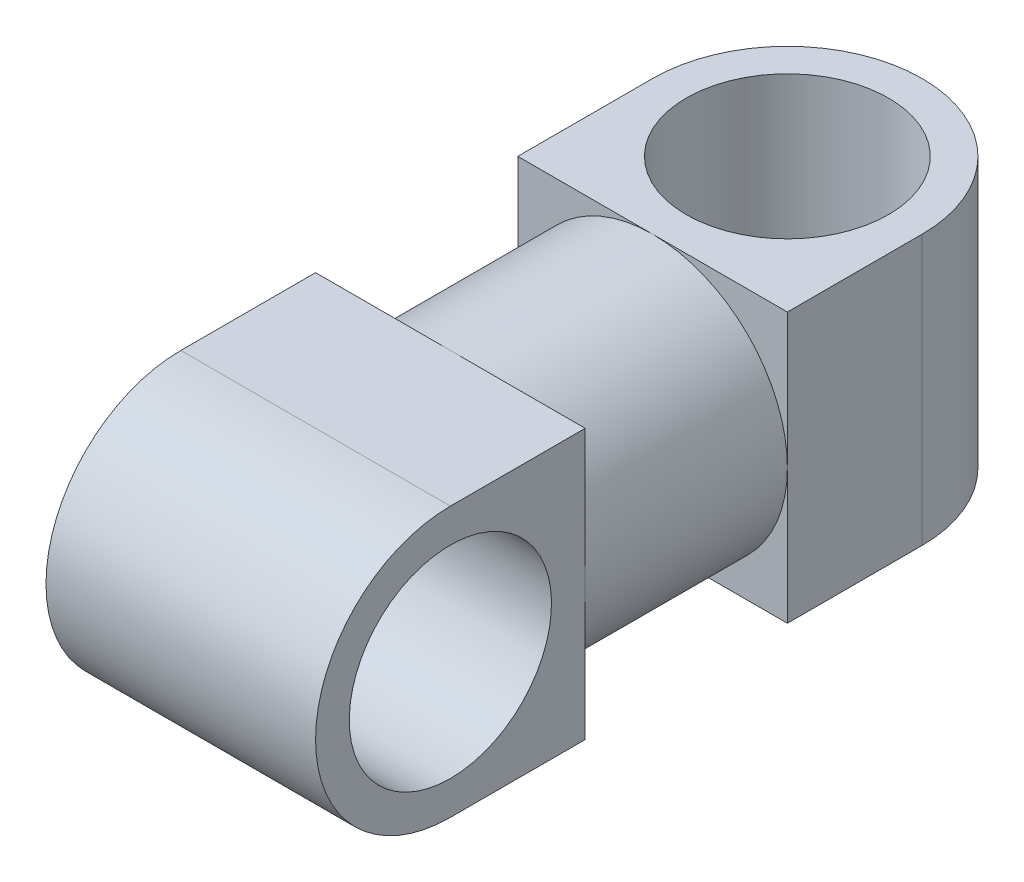
ISO-10303-21;
HEADER;
FILE_DESCRIPTION(('STEP AP214'),'2;1');
FILE_NAME('part.step','',(''),(''),'','','');
FILE_SCHEMA(('AUTOMOTIVE_DESIGN { 1 0 10303 214 1 1 1 1 }'));
ENDSEC;
DATA;
#1=APPLICATION_CONTEXT('core data for automotive mechanical design processes');
#2=APPLICATION_PROTOCOL_DEFINITION('international standard','automotive_design',2000,#1);
#3=PRODUCT_CONTEXT('',#1,'mechanical');
#4=PRODUCT('Part','Part','',(#3));
#5=PRODUCT_RELATED_PRODUCT_CATEGORY('part','',(#4));
#6=PRODUCT_DEFINITION_FORMATION('','',#4);
#7=PRODUCT_DEFINITION_CONTEXT('part definition',#1,'design');
#8=PRODUCT_DEFINITION('design','',#6,#7);
#9=PRODUCT_DEFINITION_SHAPE('','',#8);
#10=(LENGTH_UNIT() NAMED_UNIT(*) SI_UNIT(.MILLI.,.METRE.));
#11=(NAMED_UNIT(*) PLANE_ANGLE_UNIT() SI_UNIT($,.RADIAN.));
#12=(NAMED_UNIT(*) SI_UNIT($,.STERADIAN.) SOLID_ANGLE_UNIT());
#13=UNCERTAINTY_MEASURE_WITH_UNIT(LENGTH_MEASURE(1.E-05),#10,'distance_accuracy_value','');
#14=(GEOMETRIC_REPRESENTATION_CONTEXT(3) GLOBAL_UNCERTAINTY_ASSIGNED_CONTEXT((#13)) GLOBAL_UNIT_ASSIGNED_CONTEXT((#10,
#11,#12)) REPRESENTATION_CONTEXT('',''));
#15=CARTESIAN_POINT('',(0.,0.,0.));
#16=DIRECTION('',(0.,0.,1.));
#17=DIRECTION('',(1.,0.,0.));
#18=AXIS2_PLACEMENT_3D('',#15,#16,#17);
#19=CARTESIAN_POINT('',(0.,20.,50.));
#20=DIRECTION('',(0.,0.,1.));
#21=DIRECTION('',(1.,0.,0.));
#22=AXIS2_PLACEMENT_3D('',#19,#20,#21);
#23=PLANE('',#22);
#24=CARTESIAN_POINT('',(0.,20.,50.));
#25=DIRECTION('',(0.,0.,1.));
#26=DIRECTION('',(1.,0.,0.));
#27=AXIS2_PLACEMENT_3D('',#24,#25,#26);
#28=CIRCLE('',#27,20.);
#29=CARTESIAN_POINT('',(-1.49460359049434,0.0559241851801654,50.));
#30=VERTEX_POINT('',#29);
#31=CARTESIAN_POINT('',(1.49460359049433,0.0559241851801627,50.));
#32=VERTEX_POINT('',#31);
#33=EDGE_CURVE('E445',#30,#32,#28,.T.);
#34=ORIENTED_EDGE('',*,*,#33,.T.);
#35=DIRECTION('',(-1.,0.,0.));
#36=VECTOR('',#35,1.);
#37=CARTESIAN_POINT('',(20.,0.0559241851801606,50.));
#38=LINE('',#37,#36);
#39=EDGE_CURVE('E11',#32,#30,#38,.T.);
#40=ORIENTED_EDGE('',*,*,#39,.T.);
#41=EDGE_LOOP('',(#34,#40));
#42=FACE_BOUND('',#41,.T.);
#43=ADVANCED_FACE('F33',(#42),#23,.T.);
#44=CARTESIAN_POINT('',(-20.,40.,20.));
#45=DIRECTION('',(0.,0.,-1.));
#46=DIRECTION('',(-1.,0.,0.));
#47=AXIS2_PLACEMENT_3D('',#44,#45,#46);
#48=PLANE('',#47);
#49=CARTESIAN_POINT('',(0.,20.,20.));
#50=DIRECTION('',(0.,0.,1.));
#51=DIRECTION('',(1.,0.,0.));
#52=AXIS2_PLACEMENT_3D('',#49,#50,#51);
#53=CIRCLE('',#52,20.);
#54=CARTESIAN_POINT('',(20.,20.,20.));
#55=VERTEX_POINT('',#54);
#56=CARTESIAN_POINT('',(0.,40.,20.));
#57=VERTEX_POINT('',#56);
#58=EDGE_CURVE('E172',#55,#57,#53,.T.);
#59=ORIENTED_EDGE('',*,*,#58,.F.);
#60=DIRECTION('',(0.,-1.,0.));
#61=VECTOR('',#60,1.);
#62=CARTESIAN_POINT('',(20.,40.,20.));
#63=LINE('',#62,#61);
#64=CARTESIAN_POINT('',(20.,40.,20.));
#65=VERTEX_POINT('',#64);
#66=EDGE_CURVE('E216',#65,#55,#63,.T.);
#67=ORIENTED_EDGE('',*,*,#66,.F.);
#68=DIRECTION('',(1.,0.,0.));
#69=VECTOR('',#68,1.);
#70=CARTESIAN_POINT('',(-20.,40.,20.));
#71=LINE('',#70,#69);
#72=EDGE_CURVE('E193',#57,#65,#71,.T.);
#73=ORIENTED_EDGE('',*,*,#72,.F.);
#74=EDGE_LOOP('',(#59,#67,#73));
#75=FACE_BOUND('',#74,.T.);
#76=ADVANCED_FACE('F250',(#75),#48,.F.);
#77=CARTESIAN_POINT('',(-20.,20.,20.));
#78=VERTEX_POINT('',#77);
#79=EDGE_CURVE('E42',#57,#78,#53,.T.);
#80=ORIENTED_EDGE('',*,*,#79,.F.);
#81=CARTESIAN_POINT('',(-20.,40.,20.));
#82=VERTEX_POINT('',#81);
#83=EDGE_CURVE('E195',#82,#57,#71,.T.);
#84=ORIENTED_EDGE('',*,*,#83,.F.);
#85=DIRECTION('',(0.,-1.,0.));
#86=VECTOR('',#85,1.);
#87=CARTESIAN_POINT('',(-20.,40.,20.));
#88=LINE('',#87,#86);
#89=EDGE_CURVE('E37',#82,#78,#88,.T.);
#90=ORIENTED_EDGE('',*,*,#89,.T.);
#91=EDGE_LOOP('',(#80,#84,#90));
#92=FACE_BOUND('',#91,.T.);
#93=ADVANCED_FACE('F255',(#92),#48,.F.);
#94=CARTESIAN_POINT('',(0.,0.,20.));
#95=VERTEX_POINT('',#94);
#96=EDGE_CURVE('E59',#78,#95,#53,.T.);
#97=ORIENTED_EDGE('',*,*,#96,.F.);
#98=CARTESIAN_POINT('',(-20.,0.,20.));
#99=VERTEX_POINT('',#98);
#100=EDGE_CURVE('E217',#78,#99,#88,.T.);
#101=ORIENTED_EDGE('',*,*,#100,.T.);
#102=DIRECTION('',(1.,0.,0.));
#103=VECTOR('',#102,1.);
#104=CARTESIAN_POINT('',(-20.,0.,20.));
#105=LINE('',#104,#103);
#106=EDGE_CURVE('E206',#99,#95,#105,.T.);
#107=ORIENTED_EDGE('',*,*,#106,.T.);
#108=EDGE_LOOP('',(#97,#101,#107));
#109=FACE_BOUND('',#108,.T.);
#110=ADVANCED_FACE('F257',(#109),#48,.F.);
#111=EDGE_CURVE('E183',#95,#55,#53,.T.);
#112=ORIENTED_EDGE('',*,*,#111,.F.);
#113=CARTESIAN_POINT('',(20.,0.,20.));
#114=VERTEX_POINT('',#113);
#115=EDGE_CURVE('E205',#95,#114,#105,.T.);
#116=ORIENTED_EDGE('',*,*,#115,.T.);
#117=EDGE_CURVE('E215',#55,#114,#63,.T.);
#118=ORIENTED_EDGE('',*,*,#117,.F.);
#119=EDGE_LOOP('',(#112,#116,#118));
#120=FACE_BOUND('',#119,.T.);
#121=ADVANCED_FACE('F229',(#120),#48,.F.);
#122=CARTESIAN_POINT('',(0.,40.,0.));
#123=DIRECTION('',(0.,1.,0.));
#124=DIRECTION('',(0.,0.,1.));
#125=AXIS2_PLACEMENT_3D('',#122,#123,#124);
#126=PLANE('',#125);
#127=DIRECTION('',(0.,0.,1.));
#128=VECTOR('',#127,1.);
#129=CARTESIAN_POINT('',(-20.,40.,20.));
#130=LINE('',#129,#128);
#131=CARTESIAN_POINT('',(-20.,40.,0.));
#132=VERTEX_POINT('',#131);
#133=EDGE_CURVE('E190',#132,#82,#130,.T.);
#134=ORIENTED_EDGE('',*,*,#133,.T.);
#135=ORIENTED_EDGE('',*,*,#83,.T.);
#136=ORIENTED_EDGE('',*,*,#72,.T.);
#137=DIRECTION('',(0.,0.,-1.));
#138=VECTOR('',#137,1.);
#139=CARTESIAN_POINT('',(20.,40.,20.));
#140=LINE('',#139,#138);
#141=CARTESIAN_POINT('',(20.,40.,0.));
#142=VERTEX_POINT('',#141);
#143=EDGE_CURVE('E198',#65,#142,#140,.T.);
#144=ORIENTED_EDGE('',*,*,#143,.T.);
#145=CARTESIAN_POINT('',(0.,40.,0.));
#146=DIRECTION('',(0.,1.,0.));
#147=DIRECTION('',(0.,0.,1.));
#148=AXIS2_PLACEMENT_3D('',#145,#146,#147);
#149=CIRCLE('',#148,20.);
#150=EDGE_CURVE('E200',#142,#132,#149,.T.);
#151=ORIENTED_EDGE('',*,*,#150,.T.);
#152=EDGE_LOOP('',(#134,#135,#136,#144,#151));
#153=FACE_BOUND('',#152,.T.);
#154=CARTESIAN_POINT('',(0.,40.,0.));
#155=DIRECTION('',(0.,1.,0.));
#156=DIRECTION('',(0.,0.,1.));
#157=AXIS2_PLACEMENT_3D('',#154,#155,#156);
#158=CIRCLE('',#157,15.);
#159=CARTESIAN_POINT('',(0.,40.,15.));
#160=VERTEX_POINT('',#159);
#161=EDGE_CURVE('E184',#160,#160,#158,.T.);
#162=ORIENTED_EDGE('',*,*,#161,.F.);
#163=EDGE_LOOP('',(#162));
#164=FACE_BOUND('',#163,.T.);
#165=ADVANCED_FACE('F246',(#153,#164),#126,.T.);
#166=CARTESIAN_POINT('',(0.,0.,0.));
#167=DIRECTION('',(0.,1.,0.));
#168=DIRECTION('',(0.,0.,1.));
#169=AXIS2_PLACEMENT_3D('',#166,#167,#168);
#170=PLANE('',#169);
#171=DIRECTION('',(0.,0.,1.));
#172=VECTOR('',#171,1.);
#173=CARTESIAN_POINT('',(-20.,0.,20.));
#174=LINE('',#173,#172);
#175=CARTESIAN_POINT('',(-20.,0.,0.));
#176=VERTEX_POINT('',#175);
#177=EDGE_CURVE('E187',#176,#99,#174,.T.);
#178=ORIENTED_EDGE('',*,*,#177,.F.);
#179=CARTESIAN_POINT('',(0.,0.,0.));
#180=DIRECTION('',(0.,1.,0.));
#181=DIRECTION('',(0.,0.,1.));
#182=AXIS2_PLACEMENT_3D('',#179,#180,#181);
#183=CIRCLE('',#182,20.);
#184=CARTESIAN_POINT('',(20.,0.,0.));
#185=VERTEX_POINT('',#184);
#186=EDGE_CURVE('E194',#185,#176,#183,.T.);
#187=ORIENTED_EDGE('',*,*,#186,.F.);
#188=DIRECTION('',(0.,0.,-1.));
#189=VECTOR('',#188,1.);
#190=CARTESIAN_POINT('',(20.,0.,20.));
#191=LINE('',#190,#189);
#192=EDGE_CURVE('E208',#114,#185,#191,.T.);
#193=ORIENTED_EDGE('',*,*,#192,.F.);
#194=ORIENTED_EDGE('',*,*,#115,.F.);
#195=ORIENTED_EDGE('',*,*,#106,.F.);
#196=EDGE_LOOP('',(#178,#187,#193,#194,#195));
#197=FACE_BOUND('',#196,.T.);
#198=CARTESIAN_POINT('',(0.,0.,0.));
#199=DIRECTION('',(0.,1.,0.));
#200=DIRECTION('',(0.,0.,1.));
#201=AXIS2_PLACEMENT_3D('',#198,#199,#200);
#202=CIRCLE('',#201,15.);
#203=CARTESIAN_POINT('',(0.,0.,15.));
#204=VERTEX_POINT('',#203);
#205=EDGE_CURVE('E178',#204,#204,#202,.T.);
#206=ORIENTED_EDGE('',*,*,#205,.T.);
#207=EDGE_LOOP('',(#206));
#208=FACE_BOUND('',#207,.T.);
#209=ADVANCED_FACE('F235',(#197,#208),#170,.F.);
#210=CARTESIAN_POINT('',(-20.,40.,20.));
#211=DIRECTION('',(1.,0.,0.));
#212=DIRECTION('',(0.,0.,-1.));
#213=AXIS2_PLACEMENT_3D('',#210,#211,#212);
#214=PLANE('',#213);
#215=ORIENTED_EDGE('',*,*,#177,.T.);
#216=ORIENTED_EDGE('',*,*,#100,.F.);
#217=ORIENTED_EDGE('',*,*,#89,.F.);
#218=ORIENTED_EDGE('',*,*,#133,.F.);
#219=DIRECTION('',(0.,-1.,0.));
#220=VECTOR('',#219,1.);
#221=CARTESIAN_POINT('',(-20.,40.,0.));
#222=LINE('',#221,#220);
#223=EDGE_CURVE('E202',#132,#176,#222,.T.);
#224=ORIENTED_EDGE('',*,*,#223,.T.);
#225=EDGE_LOOP('',(#215,#216,#217,#218,#224));
#226=FACE_BOUND('',#225,.T.);
#227=ADVANCED_FACE('F35',(#226),#214,.F.);
#228=CARTESIAN_POINT('',(20.,40.,20.));
#229=DIRECTION('',(-1.,0.,0.));
#230=DIRECTION('',(0.,0.,1.));
#231=AXIS2_PLACEMENT_3D('',#228,#229,#230);
#232=PLANE('',#231);
#233=ORIENTED_EDGE('',*,*,#192,.T.);
#234=DIRECTION('',(0.,-1.,0.));
#235=VECTOR('',#234,1.);
#236=CARTESIAN_POINT('',(20.,40.,0.));
#237=LINE('',#236,#235);
#238=EDGE_CURVE('E213',#142,#185,#237,.T.);
#239=ORIENTED_EDGE('',*,*,#238,.F.);
#240=ORIENTED_EDGE('',*,*,#143,.F.);
#241=ORIENTED_EDGE('',*,*,#66,.T.);
#242=ORIENTED_EDGE('',*,*,#117,.T.);
#243=EDGE_LOOP('',(#233,#239,#240,#241,#242));
#244=FACE_BOUND('',#243,.T.);
#245=ADVANCED_FACE('F223',(#244),#232,.F.);
#246=CARTESIAN_POINT('',(0.,40.,0.));
#247=DIRECTION('',(0.,-1.,0.));
#248=DIRECTION('',(0.,0.,-1.));
#249=AXIS2_PLACEMENT_3D('',#246,#247,#248);
#250=CYLINDRICAL_SURFACE('',#249,20.);
#251=ORIENTED_EDGE('',*,*,#186,.T.);
#252=ORIENTED_EDGE('',*,*,#223,.F.);
#253=ORIENTED_EDGE('',*,*,#150,.F.);
#254=ORIENTED_EDGE('',*,*,#238,.T.);
#255=EDGE_LOOP('',(#251,#252,#253,#254));
#256=FACE_BOUND('',#255,.T.);
#257=ADVANCED_FACE('F239',(#256),#250,.T.);
#258=CARTESIAN_POINT('',(0.,40.,0.));
#259=DIRECTION('',(0.,-1.,0.));
#260=DIRECTION('',(0.,0.,-1.));
#261=AXIS2_PLACEMENT_3D('',#258,#259,#260);
#262=CYLINDRICAL_SURFACE('',#261,15.);
#263=ORIENTED_EDGE('',*,*,#161,.T.);
#264=EDGE_LOOP('',(#263));
#265=FACE_BOUND('',#264,.T.);
#266=ORIENTED_EDGE('',*,*,#205,.F.);
#267=EDGE_LOOP('',(#266));
#268=FACE_BOUND('',#267,.T.);
#269=ADVANCED_FACE('F275',(#265,#268),#262,.F.);
#270=CARTESIAN_POINT('',(0.,20.,50.));
#271=DIRECTION('',(0.,0.,-1.));
#272=DIRECTION('',(-1.,0.,0.));
#273=AXIS2_PLACEMENT_3D('',#270,#271,#272);
#274=CYLINDRICAL_SURFACE('',#273,20.);
#275=CARTESIAN_POINT('',(20.,20.,50.));
#276=VERTEX_POINT('',#275);
#277=CARTESIAN_POINT('',(-20.,20.,50.));
#278=VERTEX_POINT('',#277);
#279=EDGE_CURVE('E176',#276,#278,#28,.T.);
#280=ORIENTED_EDGE('',*,*,#279,.F.);
#281=EDGE_CURVE('E180',#32,#276,#28,.T.);
#282=ORIENTED_EDGE('',*,*,#281,.F.);
#283=ORIENTED_EDGE('',*,*,#33,.F.);
#284=EDGE_CURVE('E179',#278,#30,#28,.T.);
#285=ORIENTED_EDGE('',*,*,#284,.F.);
#286=EDGE_LOOP('',(#280,#282,#283,#285));
#287=FACE_BOUND('',#286,.T.);
#288=ORIENTED_EDGE('',*,*,#58,.T.);
#289=ORIENTED_EDGE('',*,*,#79,.T.);
#290=ORIENTED_EDGE('',*,*,#96,.T.);
#291=ORIENTED_EDGE('',*,*,#111,.T.);
#292=EDGE_LOOP('',(#288,#289,#290,#291));
#293=FACE_BOUND('',#292,.T.);
#294=ADVANCED_FACE('F253',(#287,#293),#274,.T.);
#295=CARTESIAN_POINT('',(20.,40.0559241851802,50.));
#296=DIRECTION('',(0.,0.,-1.));
#297=DIRECTION('',(-1.,0.,0.));
#298=AXIS2_PLACEMENT_3D('',#295,#296,#297);
#299=PLANE('',#298);
#300=DIRECTION('',(0.,-1.,0.));
#301=VECTOR('',#300,1.);
#302=CARTESIAN_POINT('',(-20.,40.0559241851802,50.));
#303=LINE('',#302,#301);
#304=CARTESIAN_POINT('',(-20.,0.055924185180165,50.));
#305=VERTEX_POINT('',#304);
#306=EDGE_CURVE('E166',#278,#305,#303,.T.);
#307=ORIENTED_EDGE('',*,*,#306,.F.);
#308=ORIENTED_EDGE('',*,*,#284,.T.);
#309=EDGE_CURVE('E45',#30,#305,#38,.T.);
#310=ORIENTED_EDGE('',*,*,#309,.T.);
#311=EDGE_LOOP('',(#307,#308,#310));
#312=FACE_BOUND('',#311,.T.);
#313=ADVANCED_FACE('F274',(#312),#299,.T.);
#314=DIRECTION('',(0.,-1.,0.));
#315=VECTOR('',#314,1.);
#316=CARTESIAN_POINT('',(20.,40.0559241851802,50.));
#317=LINE('',#316,#315);
#318=CARTESIAN_POINT('',(20.,40.0559241851802,50.));
#319=VERTEX_POINT('',#318);
#320=EDGE_CURVE('E129',#319,#276,#317,.T.);
#321=ORIENTED_EDGE('',*,*,#320,.T.);
#322=ORIENTED_EDGE('',*,*,#279,.T.);
#323=CARTESIAN_POINT('',(-20.,40.0559241851802,50.));
#324=VERTEX_POINT('',#323);
#325=EDGE_CURVE('E132',#324,#278,#303,.T.);
#326=ORIENTED_EDGE('',*,*,#325,.F.);
#327=DIRECTION('',(-1.,0.,0.));
#328=VECTOR('',#327,1.);
#329=CARTESIAN_POINT('',(20.,40.0559241851802,50.));
#330=LINE('',#329,#328);
#331=EDGE_CURVE('E126',#319,#324,#330,.T.);
#332=ORIENTED_EDGE('',*,*,#331,.F.);
#333=EDGE_LOOP('',(#321,#322,#326,#332));
#334=FACE_BOUND('',#333,.T.);
#335=ADVANCED_FACE('F128',(#334),#299,.T.);
#336=CARTESIAN_POINT('',(20.,40.0559241851802,50.));
#337=DIRECTION('',(0.,1.,0.));
#338=DIRECTION('',(-1.,0.,0.));
#339=AXIS2_PLACEMENT_3D('',#336,#337,#338);
#340=PLANE('',#339);
#341=DIRECTION('',(0.,0.,-1.));
#342=VECTOR('',#341,1.);
#343=CARTESIAN_POINT('',(-20.,40.0559241851802,50.));
#344=LINE('',#343,#342);
#345=CARTESIAN_POINT('',(-20.,40.0559241851804,70.));
#346=VERTEX_POINT('',#345);
#347=EDGE_CURVE('E164',#346,#324,#344,.T.);
#348=ORIENTED_EDGE('',*,*,#347,.F.);
#349=DIRECTION('',(-1.,0.,0.));
#350=VECTOR('',#349,1.);
#351=CARTESIAN_POINT('',(20.,40.0559241851804,70.));
#352=LINE('',#351,#350);
#353=CARTESIAN_POINT('',(20.,40.0559241851804,70.));
#354=VERTEX_POINT('',#353);
#355=EDGE_CURVE('E151',#354,#346,#352,.T.);
#356=ORIENTED_EDGE('',*,*,#355,.F.);
#357=DIRECTION('',(0.,0.,-1.));
#358=VECTOR('',#357,1.);
#359=CARTESIAN_POINT('',(20.,40.0559241851802,50.));
#360=LINE('',#359,#358);
#361=EDGE_CURVE('E144',#354,#319,#360,.T.);
#362=ORIENTED_EDGE('',*,*,#361,.T.);
#363=ORIENTED_EDGE('',*,*,#331,.T.);
#364=EDGE_LOOP('',(#348,#356,#362,#363));
#365=FACE_BOUND('',#364,.T.);
#366=ADVANCED_FACE('F150',(#365),#340,.T.);
#367=CARTESIAN_POINT('',(20.,20.0559241851804,70.0000000000002));
#368=DIRECTION('',(-1.,0.,0.));
#369=DIRECTION('',(0.,-1.,0.));
#370=AXIS2_PLACEMENT_3D('',#367,#368,#369);
#371=CYLINDRICAL_SURFACE('',#370,20.);
#372=CARTESIAN_POINT('',(-20.,20.0559241851804,70.0000000000002));
#373=DIRECTION('',(-1.,0.,0.));
#374=DIRECTION('',(0.,-1.,0.));
#375=AXIS2_PLACEMENT_3D('',#372,#373,#374);
#376=CIRCLE('',#375,20.);
#377=CARTESIAN_POINT('',(-20.,0.055924185180164,70.0000000000002));
#378=VERTEX_POINT('',#377);
#379=EDGE_CURVE('E152',#378,#346,#376,.T.);
#380=ORIENTED_EDGE('',*,*,#379,.F.);
#381=DIRECTION('',(-1.,0.,0.));
#382=VECTOR('',#381,1.);
#383=CARTESIAN_POINT('',(20.,0.0559241851801595,70.0000000000002));
#384=LINE('',#383,#382);
#385=CARTESIAN_POINT('',(20.,0.0559241851801595,70.0000000000002));
#386=VERTEX_POINT('',#385);
#387=EDGE_CURVE('E173',#386,#378,#384,.T.);
#388=ORIENTED_EDGE('',*,*,#387,.F.);
#389=CARTESIAN_POINT('',(20.,20.0559241851804,70.0000000000002));
#390=DIRECTION('',(-1.,0.,0.));
#391=DIRECTION('',(0.,-1.,0.));
#392=AXIS2_PLACEMENT_3D('',#389,#390,#391);
#393=CIRCLE('',#392,20.);
#394=EDGE_CURVE('E137',#386,#354,#393,.T.);
#395=ORIENTED_EDGE('',*,*,#394,.T.);
#396=ORIENTED_EDGE('',*,*,#355,.T.);
#397=EDGE_LOOP('',(#380,#388,#395,#396));
#398=FACE_BOUND('',#397,.T.);
#399=ADVANCED_FACE('F375',(#398),#371,.T.);
#400=CARTESIAN_POINT('',(20.,0.0559241851801606,50.));
#401=DIRECTION('',(0.,-1.,0.));
#402=DIRECTION('',(1.,0.,0.));
#403=AXIS2_PLACEMENT_3D('',#400,#401,#402);
#404=PLANE('',#403);
#405=DIRECTION('',(0.,0.,1.));
#406=VECTOR('',#405,1.);
#407=CARTESIAN_POINT('',(-20.,0.055924185180165,50.));
#408=LINE('',#407,#406);
#409=EDGE_CURVE('E155',#305,#378,#408,.T.);
#410=ORIENTED_EDGE('',*,*,#409,.F.);
#411=ORIENTED_EDGE('',*,*,#309,.F.);
#412=ORIENTED_EDGE('',*,*,#39,.F.);
#413=CARTESIAN_POINT('',(20.,0.0559241851801606,50.));
#414=VERTEX_POINT('',#413);
#415=EDGE_CURVE('E44',#414,#32,#38,.T.);
#416=ORIENTED_EDGE('',*,*,#415,.F.);
#417=DIRECTION('',(0.,0.,1.));
#418=VECTOR('',#417,1.);
#419=CARTESIAN_POINT('',(20.,0.0559241851801606,50.));
#420=LINE('',#419,#418);
#421=EDGE_CURVE('E148',#414,#386,#420,.T.);
#422=ORIENTED_EDGE('',*,*,#421,.T.);
#423=ORIENTED_EDGE('',*,*,#387,.T.);
#424=EDGE_LOOP('',(#410,#411,#412,#416,#422,#423));
#425=FACE_BOUND('',#424,.T.);
#426=ADVANCED_FACE('F383',(#425),#404,.T.);
#427=ORIENTED_EDGE('',*,*,#415,.T.);
#428=ORIENTED_EDGE('',*,*,#281,.T.);
#429=EDGE_CURVE('E147',#276,#414,#317,.T.);
#430=ORIENTED_EDGE('',*,*,#429,.T.);
#431=EDGE_LOOP('',(#427,#428,#430));
#432=FACE_BOUND('',#431,.T.);
#433=ADVANCED_FACE('F360',(#432),#299,.T.);
#434=CARTESIAN_POINT('',(20.,20.0559241851804,70.0000000000002));
#435=DIRECTION('',(-1.,0.,0.));
#436=DIRECTION('',(0.,-1.,0.));
#437=AXIS2_PLACEMENT_3D('',#434,#435,#436);
#438=PLANE('',#437);
#439=CARTESIAN_POINT('',(20.,20.0559241851804,70.0000000000002));
#440=DIRECTION('',(-1.,0.,0.));
#441=DIRECTION('',(0.,-1.,0.));
#442=AXIS2_PLACEMENT_3D('',#439,#440,#441);
#443=CIRCLE('',#442,15.);
#444=CARTESIAN_POINT('',(20.,5.05592418518037,70.0000000000002));
#445=VERTEX_POINT('',#444);
#446=EDGE_CURVE('E167',#445,#445,#443,.T.);
#447=ORIENTED_EDGE('',*,*,#446,.T.);
#448=EDGE_LOOP('',(#447));
#449=FACE_BOUND('',#448,.T.);
#450=ORIENTED_EDGE('',*,*,#361,.F.);
#451=ORIENTED_EDGE('',*,*,#394,.F.);
#452=ORIENTED_EDGE('',*,*,#421,.F.);
#453=ORIENTED_EDGE('',*,*,#429,.F.);
#454=ORIENTED_EDGE('',*,*,#320,.F.);
#455=EDGE_LOOP('',(#450,#451,#452,#453,#454));
#456=FACE_BOUND('',#455,.T.);
#457=ADVANCED_FACE('F142',(#449,#456),#438,.F.);
#458=CARTESIAN_POINT('',(-20.,20.0559241851804,70.0000000000002));
#459=DIRECTION('',(-1.,0.,0.));
#460=DIRECTION('',(0.,-1.,0.));
#461=AXIS2_PLACEMENT_3D('',#458,#459,#460);
#462=PLANE('',#461);
#463=CARTESIAN_POINT('',(-20.,20.0559241851804,70.0000000000002));
#464=DIRECTION('',(-1.,0.,0.));
#465=DIRECTION('',(0.,-1.,0.));
#466=AXIS2_PLACEMENT_3D('',#463,#464,#465);
#467=CIRCLE('',#466,15.);
#468=CARTESIAN_POINT('',(-20.,5.05592418518037,70.0000000000002));
#469=VERTEX_POINT('',#468);
#470=EDGE_CURVE('E158',#469,#469,#467,.T.);
#471=ORIENTED_EDGE('',*,*,#470,.F.);
#472=EDGE_LOOP('',(#471));
#473=FACE_BOUND('',#472,.T.);
#474=ORIENTED_EDGE('',*,*,#347,.T.);
#475=ORIENTED_EDGE('',*,*,#325,.T.);
#476=ORIENTED_EDGE('',*,*,#306,.T.);
#477=ORIENTED_EDGE('',*,*,#409,.T.);
#478=ORIENTED_EDGE('',*,*,#379,.T.);
#479=EDGE_LOOP('',(#474,#475,#476,#477,#478));
#480=FACE_BOUND('',#479,.T.);
#481=ADVANCED_FACE('F409',(#473,#480),#462,.T.);
#482=CARTESIAN_POINT('',(20.,20.0559241851804,70.0000000000002));
#483=DIRECTION('',(-1.,0.,0.));
#484=DIRECTION('',(0.,-1.,0.));
#485=AXIS2_PLACEMENT_3D('',#482,#483,#484);
#486=CYLINDRICAL_SURFACE('',#485,15.);
#487=ORIENTED_EDGE('',*,*,#446,.F.);
#488=EDGE_LOOP('',(#487));
#489=FACE_BOUND('',#488,.T.);
#490=ORIENTED_EDGE('',*,*,#470,.T.);
#491=EDGE_LOOP('',(#490));
#492=FACE_BOUND('',#491,.T.);
#493=ADVANCED_FACE('F419',(#489,#492),#486,.F.);
#494=CLOSED_SHELL('',(#43,#76,#93,#110,#121,#165,#209,#227,#245,#257,#269,#294,#313,#335,#366,
#399,#426,#433,#457,#481,#493));
#495=MANIFOLD_SOLID_BREP('B2',#494);
#496=ADVANCED_BREP_SHAPE_REPRESENTATION('',(#18,#495),#14);
#497=SHAPE_DEFINITION_REPRESENTATION(#9,#496);
ENDSEC;
END-ISO-10303-21;
